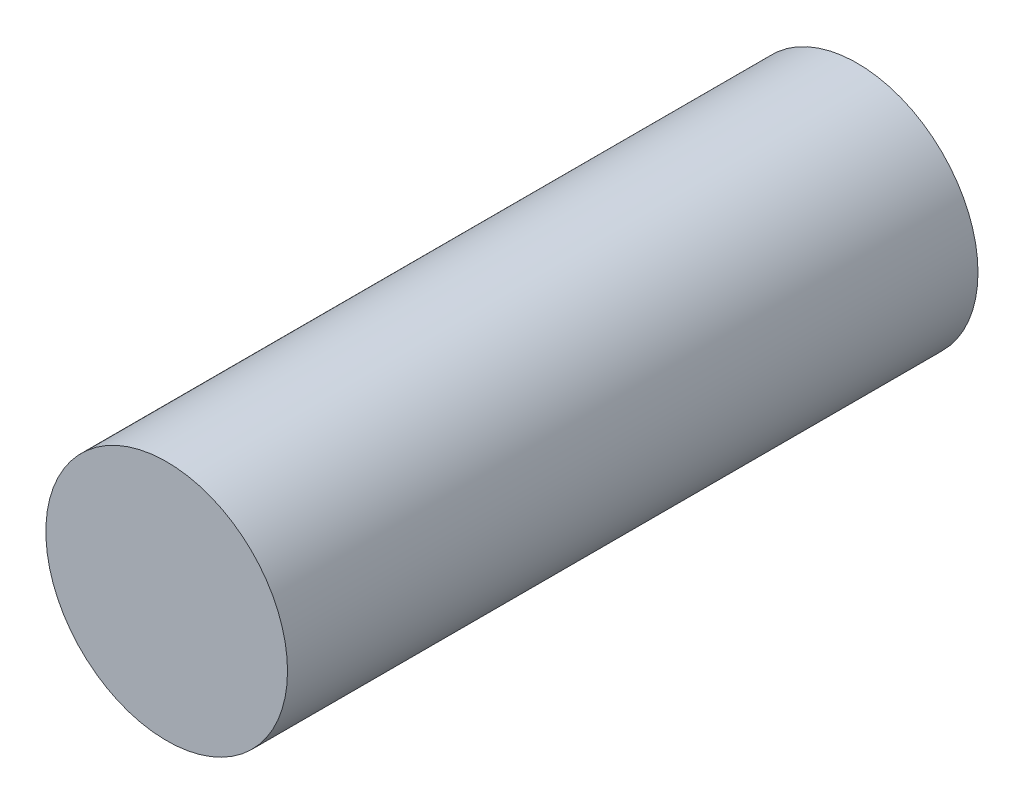
ISO-10303-21;
HEADER;
FILE_DESCRIPTION(('STEP AP214'),'2;1');
FILE_NAME('part.step','',(''),(''),'','','');
FILE_SCHEMA(('AUTOMOTIVE_DESIGN { 1 0 10303 214 1 1 1 1 }'));
ENDSEC;
DATA;
#1=APPLICATION_CONTEXT('core data for automotive mechanical design processes');
#2=APPLICATION_PROTOCOL_DEFINITION('international standard','automotive_design',2000,#1);
#3=PRODUCT_CONTEXT('',#1,'mechanical');
#4=PRODUCT('Part','Part','',(#3));
#5=PRODUCT_RELATED_PRODUCT_CATEGORY('part','',(#4));
#6=PRODUCT_DEFINITION_FORMATION('','',#4);
#7=PRODUCT_DEFINITION_CONTEXT('part definition',#1,'design');
#8=PRODUCT_DEFINITION('design','',#6,#7);
#9=PRODUCT_DEFINITION_SHAPE('','',#8);
#10=(LENGTH_UNIT() NAMED_UNIT(*) SI_UNIT(.MILLI.,.METRE.));
#11=(NAMED_UNIT(*) PLANE_ANGLE_UNIT() SI_UNIT($,.RADIAN.));
#12=(NAMED_UNIT(*) SI_UNIT($,.STERADIAN.) SOLID_ANGLE_UNIT());
#13=UNCERTAINTY_MEASURE_WITH_UNIT(LENGTH_MEASURE(1.E-05),#10,'distance_accuracy_value','');
#14=(GEOMETRIC_REPRESENTATION_CONTEXT(3) GLOBAL_UNCERTAINTY_ASSIGNED_CONTEXT((#13)) GLOBAL_UNIT_ASSIGNED_CONTEXT((#10,
#11,#12)) REPRESENTATION_CONTEXT('',''));
#15=CARTESIAN_POINT('',(0.,0.,0.));
#16=DIRECTION('',(0.,0.,1.));
#17=DIRECTION('',(1.,0.,0.));
#18=AXIS2_PLACEMENT_3D('',#15,#16,#17);
#19=CARTESIAN_POINT('',(0.,0.,40.));
#20=DIRECTION('',(0.,0.,-1.));
#21=DIRECTION('',(-1.,0.,0.));
#22=AXIS2_PLACEMENT_3D('',#19,#20,#21);
#23=CYLINDRICAL_SURFACE('',#22,7.);
#24=CARTESIAN_POINT('',(0.,0.,40.));
#25=DIRECTION('',(0.,0.,1.));
#26=DIRECTION('',(1.,0.,0.));
#27=AXIS2_PLACEMENT_3D('',#24,#25,#26);
#28=CIRCLE('',#27,7.);
#29=CARTESIAN_POINT('',(7.,0.,40.));
#30=VERTEX_POINT('',#29);
#31=EDGE_CURVE('E10',#30,#30,#28,.T.);
#32=ORIENTED_EDGE('',*,*,#31,.F.);
#33=EDGE_LOOP('',(#32));
#34=FACE_BOUND('',#33,.T.);
#35=CARTESIAN_POINT('',(0.,0.,0.));
#36=DIRECTION('',(0.,0.,1.));
#37=DIRECTION('',(1.,0.,0.));
#38=AXIS2_PLACEMENT_3D('',#35,#36,#37);
#39=CIRCLE('',#38,7.);
#40=CARTESIAN_POINT('',(7.,0.,0.));
#41=VERTEX_POINT('',#40);
#42=EDGE_CURVE('E32',#41,#41,#39,.T.);
#43=ORIENTED_EDGE('',*,*,#42,.T.);
#44=EDGE_LOOP('',(#43));
#45=FACE_BOUND('',#44,.T.);
#46=ADVANCED_FACE('F29',(#34,#45),#23,.T.);
#47=CARTESIAN_POINT('',(0.,0.,40.));
#48=DIRECTION('',(0.,0.,1.));
#49=DIRECTION('',(1.,0.,0.));
#50=AXIS2_PLACEMENT_3D('',#47,#48,#49);
#51=PLANE('',#50);
#52=ORIENTED_EDGE('',*,*,#31,.T.);
#53=EDGE_LOOP('',(#52));
#54=FACE_BOUND('',#53,.T.);
#55=ADVANCED_FACE('F44',(#54),#51,.T.);
#56=CARTESIAN_POINT('',(0.,0.,0.));
#57=DIRECTION('',(0.,0.,1.));
#58=DIRECTION('',(1.,0.,0.));
#59=AXIS2_PLACEMENT_3D('',#56,#57,#58);
#60=PLANE('',#59);
#61=ORIENTED_EDGE('',*,*,#42,.F.);
#62=EDGE_LOOP('',(#61));
#63=FACE_BOUND('',#62,.T.);
#64=ADVANCED_FACE('F42',(#63),#60,.F.);
#65=CLOSED_SHELL('',(#46,#55,#64));
#66=MANIFOLD_SOLID_BREP('B2',#65);
#67=ADVANCED_BREP_SHAPE_REPRESENTATION('',(#18,#66),#14);
#68=SHAPE_DEFINITION_REPRESENTATION(#9,#67);
ENDSEC;
END-ISO-10303-21;
